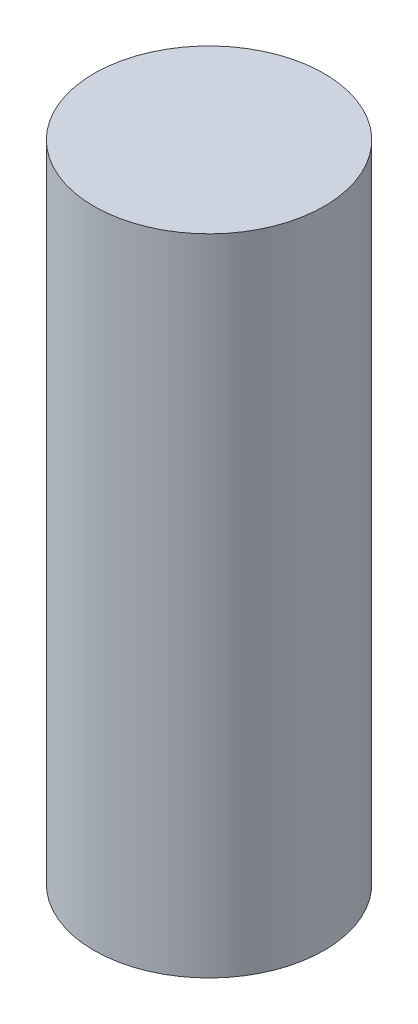
ISO-10303-21;
HEADER;
FILE_DESCRIPTION(('STEP AP214'),'2;1');
FILE_NAME('part.step','',(''),(''),'','','');
FILE_SCHEMA(('AUTOMOTIVE_DESIGN { 1 0 10303 214 1 1 1 1 }'));
ENDSEC;
DATA;
#1=APPLICATION_CONTEXT('core data for automotive mechanical design processes');
#2=APPLICATION_PROTOCOL_DEFINITION('international standard','automotive_design',2000,#1);
#3=PRODUCT_CONTEXT('',#1,'mechanical');
#4=PRODUCT('Part','Part','',(#3));
#5=PRODUCT_RELATED_PRODUCT_CATEGORY('part','',(#4));
#6=PRODUCT_DEFINITION_FORMATION('','',#4);
#7=PRODUCT_DEFINITION_CONTEXT('part definition',#1,'design');
#8=PRODUCT_DEFINITION('design','',#6,#7);
#9=PRODUCT_DEFINITION_SHAPE('','',#8);
#10=(LENGTH_UNIT() NAMED_UNIT(*) SI_UNIT(.MILLI.,.METRE.));
#11=(NAMED_UNIT(*) PLANE_ANGLE_UNIT() SI_UNIT($,.RADIAN.));
#12=(NAMED_UNIT(*) SI_UNIT($,.STERADIAN.) SOLID_ANGLE_UNIT());
#13=UNCERTAINTY_MEASURE_WITH_UNIT(LENGTH_MEASURE(1.E-05),#10,'distance_accuracy_value','');
#14=(GEOMETRIC_REPRESENTATION_CONTEXT(3) GLOBAL_UNCERTAINTY_ASSIGNED_CONTEXT((#13)) GLOBAL_UNIT_ASSIGNED_CONTEXT((#10,
#11,#12)) REPRESENTATION_CONTEXT('',''));
#15=CARTESIAN_POINT('',(0.,0.,0.));
#16=DIRECTION('',(0.,0.,1.));
#17=DIRECTION('',(1.,0.,0.));
#18=AXIS2_PLACEMENT_3D('',#15,#16,#17);
#19=CARTESIAN_POINT('',(0.,-14.,0.));
#20=DIRECTION('',(0.,1.,0.));
#21=DIRECTION('',(0.,0.,1.));
#22=AXIS2_PLACEMENT_3D('',#19,#20,#21);
#23=CYLINDRICAL_SURFACE('',#22,5.);
#24=CARTESIAN_POINT('',(0.,-14.,0.));
#25=DIRECTION('',(0.,1.,0.));
#26=DIRECTION('',(0.,0.,1.));
#27=AXIS2_PLACEMENT_3D('',#24,#25,#26);
#28=CIRCLE('',#27,5.);
#29=CARTESIAN_POINT('',(0.,-14.,5.));
#30=VERTEX_POINT('',#29);
#31=EDGE_CURVE('E10',#30,#30,#28,.T.);
#32=ORIENTED_EDGE('',*,*,#31,.T.);
#33=EDGE_LOOP('',(#32));
#34=FACE_BOUND('',#33,.T.);
#35=CARTESIAN_POINT('',(0.,14.,0.));
#36=DIRECTION('',(0.,1.,0.));
#37=DIRECTION('',(0.,0.,1.));
#38=AXIS2_PLACEMENT_3D('',#35,#36,#37);
#39=CIRCLE('',#38,5.);
#40=CARTESIAN_POINT('',(0.,14.,5.));
#41=VERTEX_POINT('',#40);
#42=EDGE_CURVE('E37',#41,#41,#39,.T.);
#43=ORIENTED_EDGE('',*,*,#42,.F.);
#44=EDGE_LOOP('',(#43));
#45=FACE_BOUND('',#44,.T.);
#46=ADVANCED_FACE('F31',(#34,#45),#23,.T.);
#47=CARTESIAN_POINT('',(0.,-14.,0.));
#48=DIRECTION('',(0.,1.,0.));
#49=DIRECTION('',(0.,0.,1.));
#50=AXIS2_PLACEMENT_3D('',#47,#48,#49);
#51=PLANE('',#50);
#52=ORIENTED_EDGE('',*,*,#31,.F.);
#53=EDGE_LOOP('',(#52));
#54=FACE_BOUND('',#53,.T.);
#55=ADVANCED_FACE('F46',(#54),#51,.F.);
#56=CARTESIAN_POINT('',(0.,14.,0.));
#57=DIRECTION('',(0.,1.,0.));
#58=DIRECTION('',(0.,0.,1.));
#59=AXIS2_PLACEMENT_3D('',#56,#57,#58);
#60=PLANE('',#59);
#61=ORIENTED_EDGE('',*,*,#42,.T.);
#62=EDGE_LOOP('',(#61));
#63=FACE_BOUND('',#62,.T.);
#64=ADVANCED_FACE('F43',(#63),#60,.T.);
#65=CLOSED_SHELL('',(#46,#55,#64));
#66=MANIFOLD_SOLID_BREP('B2',#65);
#67=ADVANCED_BREP_SHAPE_REPRESENTATION('',(#18,#66),#14);
#68=SHAPE_DEFINITION_REPRESENTATION(#9,#67);
ENDSEC;
END-ISO-10303-21;
